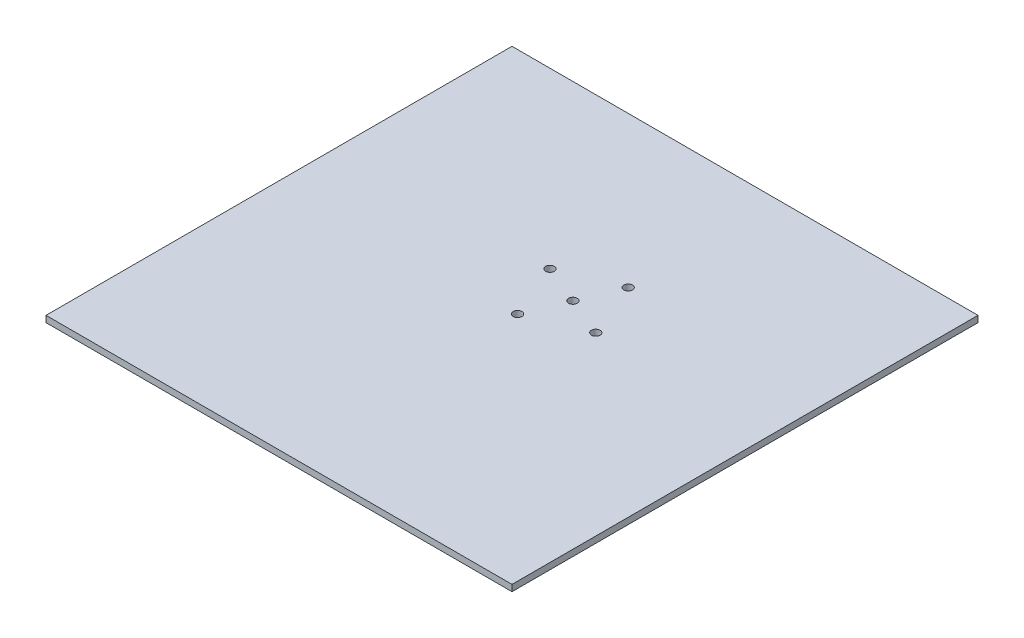
ISO-10303-21;
HEADER;
FILE_DESCRIPTION(('STEP AP214'),'2;1');
FILE_NAME('part.step','',(''),(''),'','','');
FILE_SCHEMA(('AUTOMOTIVE_DESIGN { 1 0 10303 214 1 1 1 1 }'));
ENDSEC;
DATA;
#1=APPLICATION_CONTEXT('core data for automotive mechanical design processes');
#2=APPLICATION_PROTOCOL_DEFINITION('international standard','automotive_design',2000,#1);
#3=PRODUCT_CONTEXT('',#1,'mechanical');
#4=PRODUCT('Part','Part','',(#3));
#5=PRODUCT_RELATED_PRODUCT_CATEGORY('part','',(#4));
#6=PRODUCT_DEFINITION_FORMATION('','',#4);
#7=PRODUCT_DEFINITION_CONTEXT('part definition',#1,'design');
#8=PRODUCT_DEFINITION('design','',#6,#7);
#9=PRODUCT_DEFINITION_SHAPE('','',#8);
#10=(LENGTH_UNIT() NAMED_UNIT(*) SI_UNIT(.MILLI.,.METRE.));
#11=(NAMED_UNIT(*) PLANE_ANGLE_UNIT() SI_UNIT($,.RADIAN.));
#12=(NAMED_UNIT(*) SI_UNIT($,.STERADIAN.) SOLID_ANGLE_UNIT());
#13=UNCERTAINTY_MEASURE_WITH_UNIT(LENGTH_MEASURE(1.E-05),#10,'distance_accuracy_value','');
#14=(GEOMETRIC_REPRESENTATION_CONTEXT(3) GLOBAL_UNCERTAINTY_ASSIGNED_CONTEXT((#13)) GLOBAL_UNIT_ASSIGNED_CONTEXT((#10,
#11,#12)) REPRESENTATION_CONTEXT('',''));
#15=CARTESIAN_POINT('',(0.,0.,0.));
#16=DIRECTION('',(0.,0.,1.));
#17=DIRECTION('',(1.,0.,0.));
#18=AXIS2_PLACEMENT_3D('',#15,#16,#17);
#19=CARTESIAN_POINT('',(110.,3.,-110.));
#20=DIRECTION('',(-1.,0.,0.));
#21=DIRECTION('',(0.,0.,1.));
#22=AXIS2_PLACEMENT_3D('',#19,#20,#21);
#23=PLANE('',#22);
#24=DIRECTION('',(0.,0.,-1.));
#25=VECTOR('',#24,1.);
#26=CARTESIAN_POINT('',(110.,0.,-110.));
#27=LINE('',#26,#25);
#28=CARTESIAN_POINT('',(110.,0.,110.));
#29=VERTEX_POINT('',#28);
#30=CARTESIAN_POINT('',(110.,0.,-110.));
#31=VERTEX_POINT('',#30);
#32=EDGE_CURVE('E105',#29,#31,#27,.T.);
#33=ORIENTED_EDGE('',*,*,#32,.T.);
#34=DIRECTION('',(0.,-1.,0.));
#35=VECTOR('',#34,1.);
#36=CARTESIAN_POINT('',(110.,3.,-110.));
#37=LINE('',#36,#35);
#38=CARTESIAN_POINT('',(110.,3.,-110.));
#39=VERTEX_POINT('',#38);
#40=EDGE_CURVE('E11',#39,#31,#37,.T.);
#41=ORIENTED_EDGE('',*,*,#40,.F.);
#42=DIRECTION('',(0.,0.,-1.));
#43=VECTOR('',#42,1.);
#44=CARTESIAN_POINT('',(110.,3.,-110.));
#45=LINE('',#44,#43);
#46=CARTESIAN_POINT('',(110.,3.,110.));
#47=VERTEX_POINT('',#46);
#48=EDGE_CURVE('E92',#47,#39,#45,.T.);
#49=ORIENTED_EDGE('',*,*,#48,.F.);
#50=DIRECTION('',(0.,-1.,0.));
#51=VECTOR('',#50,1.);
#52=CARTESIAN_POINT('',(110.,3.,110.));
#53=LINE('',#52,#51);
#54=EDGE_CURVE('E101',#47,#29,#53,.T.);
#55=ORIENTED_EDGE('',*,*,#54,.T.);
#56=EDGE_LOOP('',(#33,#41,#49,#55));
#57=FACE_BOUND('',#56,.T.);
#58=ADVANCED_FACE('F39',(#57),#23,.F.);
#59=CARTESIAN_POINT('',(-110.,3.,-110.));
#60=DIRECTION('',(0.,0.,1.));
#61=DIRECTION('',(1.,0.,0.));
#62=AXIS2_PLACEMENT_3D('',#59,#60,#61);
#63=PLANE('',#62);
#64=DIRECTION('',(-1.,0.,0.));
#65=VECTOR('',#64,1.);
#66=CARTESIAN_POINT('',(-110.,0.,-110.));
#67=LINE('',#66,#65);
#68=CARTESIAN_POINT('',(-110.,0.,-110.));
#69=VERTEX_POINT('',#68);
#70=EDGE_CURVE('E96',#31,#69,#67,.T.);
#71=ORIENTED_EDGE('',*,*,#70,.T.);
#72=DIRECTION('',(0.,-1.,0.));
#73=VECTOR('',#72,1.);
#74=CARTESIAN_POINT('',(-110.,3.,-110.));
#75=LINE('',#74,#73);
#76=CARTESIAN_POINT('',(-110.,3.,-110.));
#77=VERTEX_POINT('',#76);
#78=EDGE_CURVE('E48',#77,#69,#75,.T.);
#79=ORIENTED_EDGE('',*,*,#78,.F.);
#80=DIRECTION('',(-1.,0.,0.));
#81=VECTOR('',#80,1.);
#82=CARTESIAN_POINT('',(-110.,3.,-110.));
#83=LINE('',#82,#81);
#84=EDGE_CURVE('E87',#39,#77,#83,.T.);
#85=ORIENTED_EDGE('',*,*,#84,.F.);
#86=ORIENTED_EDGE('',*,*,#40,.T.);
#87=EDGE_LOOP('',(#71,#79,#85,#86));
#88=FACE_BOUND('',#87,.T.);
#89=ADVANCED_FACE('F95',(#88),#63,.F.);
#90=CARTESIAN_POINT('',(-110.,3.,-110.));
#91=DIRECTION('',(1.,0.,0.));
#92=DIRECTION('',(0.,0.,-1.));
#93=AXIS2_PLACEMENT_3D('',#90,#91,#92);
#94=PLANE('',#93);
#95=DIRECTION('',(0.,0.,1.));
#96=VECTOR('',#95,1.);
#97=CARTESIAN_POINT('',(-110.,0.,-110.));
#98=LINE('',#97,#96);
#99=CARTESIAN_POINT('',(-110.,0.,110.));
#100=VERTEX_POINT('',#99);
#101=EDGE_CURVE('E74',#69,#100,#98,.T.);
#102=ORIENTED_EDGE('',*,*,#101,.T.);
#103=DIRECTION('',(0.,-1.,0.));
#104=VECTOR('',#103,1.);
#105=CARTESIAN_POINT('',(-110.,3.,110.));
#106=LINE('',#105,#104);
#107=CARTESIAN_POINT('',(-110.,3.,110.));
#108=VERTEX_POINT('',#107);
#109=EDGE_CURVE('E97',#108,#100,#106,.T.);
#110=ORIENTED_EDGE('',*,*,#109,.F.);
#111=DIRECTION('',(0.,0.,1.));
#112=VECTOR('',#111,1.);
#113=CARTESIAN_POINT('',(-110.,3.,-110.));
#114=LINE('',#113,#112);
#115=EDGE_CURVE('E90',#77,#108,#114,.T.);
#116=ORIENTED_EDGE('',*,*,#115,.F.);
#117=ORIENTED_EDGE('',*,*,#78,.T.);
#118=EDGE_LOOP('',(#102,#110,#116,#117));
#119=FACE_BOUND('',#118,.T.);
#120=ADVANCED_FACE('F99',(#119),#94,.F.);
#121=CARTESIAN_POINT('',(-110.,3.,110.));
#122=DIRECTION('',(0.,0.,-1.));
#123=DIRECTION('',(-1.,0.,0.));
#124=AXIS2_PLACEMENT_3D('',#121,#122,#123);
#125=PLANE('',#124);
#126=DIRECTION('',(1.,0.,0.));
#127=VECTOR('',#126,1.);
#128=CARTESIAN_POINT('',(-110.,0.,110.));
#129=LINE('',#128,#127);
#130=EDGE_CURVE('E80',#100,#29,#129,.T.);
#131=ORIENTED_EDGE('',*,*,#130,.T.);
#132=ORIENTED_EDGE('',*,*,#54,.F.);
#133=DIRECTION('',(1.,0.,0.));
#134=VECTOR('',#133,1.);
#135=CARTESIAN_POINT('',(-110.,3.,110.));
#136=LINE('',#135,#134);
#137=EDGE_CURVE('E57',#108,#47,#136,.T.);
#138=ORIENTED_EDGE('',*,*,#137,.F.);
#139=ORIENTED_EDGE('',*,*,#109,.T.);
#140=EDGE_LOOP('',(#131,#132,#138,#139));
#141=FACE_BOUND('',#140,.T.);
#142=ADVANCED_FACE('F161',(#141),#125,.F.);
#143=CARTESIAN_POINT('',(0.,3.,0.));
#144=DIRECTION('',(0.,1.,0.));
#145=DIRECTION('',(0.,0.,1.));
#146=AXIS2_PLACEMENT_3D('',#143,#144,#145);
#147=PLANE('',#146);
#148=CARTESIAN_POINT('',(16.0549965244678,3.,-38.8102703752413));
#149=DIRECTION('',(0.,-1.,0.));
#150=DIRECTION('',(0.,0.,-1.));
#151=AXIS2_PLACEMENT_3D('',#148,#149,#150);
#152=CIRCLE('',#151,2.05);
#153=CARTESIAN_POINT('',(16.0549965244678,3.,-40.8602703752413));
#154=VERTEX_POINT('',#153);
#155=EDGE_CURVE('E117',#154,#154,#152,.T.);
#156=ORIENTED_EDGE('',*,*,#155,.T.);
#157=EDGE_LOOP('',(#156));
#158=FACE_BOUND('',#157,.T.);
#159=CARTESIAN_POINT('',(8.40976008424499,3.,-20.3291892441741));
#160=DIRECTION('',(0.,-1.,0.));
#161=DIRECTION('',(0.,0.,-1.));
#162=AXIS2_PLACEMENT_3D('',#159,#160,#161);
#163=CIRCLE('',#162,2.05);
#164=CARTESIAN_POINT('',(8.40976008424499,3.,-22.3791892441741));
#165=VERTEX_POINT('',#164);
#166=EDGE_CURVE('E234',#165,#165,#163,.T.);
#167=ORIENTED_EDGE('',*,*,#166,.T.);
#168=EDGE_LOOP('',(#167));
#169=FACE_BOUND('',#168,.T.);
#170=CARTESIAN_POINT('',(26.8908412153122,3.,-12.6839528039512));
#171=DIRECTION('',(0.,-1.,0.));
#172=DIRECTION('',(0.,0.,-1.));
#173=AXIS2_PLACEMENT_3D('',#170,#171,#172);
#174=CIRCLE('',#173,2.04999999999999);
#175=CARTESIAN_POINT('',(26.8908412153122,3.,-14.7339528039512));
#176=VERTEX_POINT('',#175);
#177=EDGE_CURVE('E224',#176,#176,#174,.T.);
#178=ORIENTED_EDGE('',*,*,#177,.T.);
#179=EDGE_LOOP('',(#178));
#180=FACE_BOUND('',#179,.T.);
#181=CARTESIAN_POINT('',(0.764523644022143,3.,-1.84810811310683));
#182=DIRECTION('',(0.,-1.,0.));
#183=DIRECTION('',(0.,0.,-1.));
#184=AXIS2_PLACEMENT_3D('',#181,#182,#183);
#185=CIRCLE('',#184,2.05);
#186=CARTESIAN_POINT('',(0.764523644022143,3.,-3.89810811310683));
#187=VERTEX_POINT('',#186);
#188=EDGE_CURVE('E235',#187,#187,#185,.T.);
#189=ORIENTED_EDGE('',*,*,#188,.T.);
#190=EDGE_LOOP('',(#189));
#191=FACE_BOUND('',#190,.T.);
#192=CARTESIAN_POINT('',(-10.0713210468222,3.,-27.9744256843969));
#193=DIRECTION('',(0.,-1.,0.));
#194=DIRECTION('',(0.,0.,-1.));
#195=AXIS2_PLACEMENT_3D('',#192,#193,#194);
#196=CIRCLE('',#195,2.05);
#197=CARTESIAN_POINT('',(-10.0713210468222,3.,-30.0244256843969));
#198=VERTEX_POINT('',#197);
#199=EDGE_CURVE('E240',#198,#198,#196,.T.);
#200=ORIENTED_EDGE('',*,*,#199,.T.);
#201=EDGE_LOOP('',(#200));
#202=FACE_BOUND('',#201,.T.);
#203=ORIENTED_EDGE('',*,*,#48,.T.);
#204=ORIENTED_EDGE('',*,*,#84,.T.);
#205=ORIENTED_EDGE('',*,*,#115,.T.);
#206=ORIENTED_EDGE('',*,*,#137,.T.);
#207=EDGE_LOOP('',(#203,#204,#205,#206));
#208=FACE_BOUND('',#207,.T.);
#209=ADVANCED_FACE('F88',(#158,#169,#180,#191,#202,#208),#147,.T.);
#210=CARTESIAN_POINT('',(0.,0.,0.));
#211=DIRECTION('',(0.,1.,0.));
#212=DIRECTION('',(0.,0.,1.));
#213=AXIS2_PLACEMENT_3D('',#210,#211,#212);
#214=PLANE('',#213);
#215=CARTESIAN_POINT('',(16.0549965244678,0.,-38.8102703752413));
#216=DIRECTION('',(0.,1.,0.));
#217=DIRECTION('',(0.,0.,1.));
#218=AXIS2_PLACEMENT_3D('',#215,#216,#217);
#219=CIRCLE('',#218,2.05);
#220=CARTESIAN_POINT('',(16.0549965244678,0.,-36.7602703752413));
#221=VERTEX_POINT('',#220);
#222=EDGE_CURVE('E42',#221,#221,#219,.T.);
#223=ORIENTED_EDGE('',*,*,#222,.T.);
#224=EDGE_LOOP('',(#223));
#225=FACE_BOUND('',#224,.T.);
#226=CARTESIAN_POINT('',(8.40976008424499,0.,-20.3291892441741));
#227=DIRECTION('',(0.,1.,0.));
#228=DIRECTION('',(0.,0.,1.));
#229=AXIS2_PLACEMENT_3D('',#226,#227,#228);
#230=CIRCLE('',#229,2.05);
#231=CARTESIAN_POINT('',(8.40976008424499,0.,-18.279189244174));
#232=VERTEX_POINT('',#231);
#233=EDGE_CURVE('E122',#232,#232,#230,.T.);
#234=ORIENTED_EDGE('',*,*,#233,.T.);
#235=EDGE_LOOP('',(#234));
#236=FACE_BOUND('',#235,.T.);
#237=CARTESIAN_POINT('',(26.8908412153122,0.,-12.6839528039512));
#238=DIRECTION('',(0.,1.,0.));
#239=DIRECTION('',(0.,0.,1.));
#240=AXIS2_PLACEMENT_3D('',#237,#238,#239);
#241=CIRCLE('',#240,2.04999999999999);
#242=CARTESIAN_POINT('',(26.8908412153122,0.,-10.6339528039512));
#243=VERTEX_POINT('',#242);
#244=EDGE_CURVE('E120',#243,#243,#241,.T.);
#245=ORIENTED_EDGE('',*,*,#244,.T.);
#246=EDGE_LOOP('',(#245));
#247=FACE_BOUND('',#246,.T.);
#248=CARTESIAN_POINT('',(0.764523644022143,0.,-1.84810811310683));
#249=DIRECTION('',(0.,1.,0.));
#250=DIRECTION('',(0.,0.,1.));
#251=AXIS2_PLACEMENT_3D('',#248,#249,#250);
#252=CIRCLE('',#251,2.05);
#253=CARTESIAN_POINT('',(0.764523644022143,0.,0.201891886893164));
#254=VERTEX_POINT('',#253);
#255=EDGE_CURVE('E116',#254,#254,#252,.T.);
#256=ORIENTED_EDGE('',*,*,#255,.T.);
#257=EDGE_LOOP('',(#256));
#258=FACE_BOUND('',#257,.T.);
#259=CARTESIAN_POINT('',(-10.0713210468222,0.,-27.9744256843969));
#260=DIRECTION('',(0.,1.,0.));
#261=DIRECTION('',(0.,0.,1.));
#262=AXIS2_PLACEMENT_3D('',#259,#260,#261);
#263=CIRCLE('',#262,2.05);
#264=CARTESIAN_POINT('',(-10.0713210468222,0.,-25.9244256843969));
#265=VERTEX_POINT('',#264);
#266=EDGE_CURVE('E113',#265,#265,#263,.T.);
#267=ORIENTED_EDGE('',*,*,#266,.T.);
#268=EDGE_LOOP('',(#267));
#269=FACE_BOUND('',#268,.T.);
#270=ORIENTED_EDGE('',*,*,#32,.F.);
#271=ORIENTED_EDGE('',*,*,#130,.F.);
#272=ORIENTED_EDGE('',*,*,#101,.F.);
#273=ORIENTED_EDGE('',*,*,#70,.F.);
#274=EDGE_LOOP('',(#270,#271,#272,#273));
#275=FACE_BOUND('',#274,.T.);
#276=ADVANCED_FACE('F129',(#225,#236,#247,#258,#269,#275),#214,.F.);
#277=CARTESIAN_POINT('',(-10.0713210468222,3.,-27.9744256843969));
#278=DIRECTION('',(0.,-1.,0.));
#279=DIRECTION('',(0.,0.,-1.));
#280=AXIS2_PLACEMENT_3D('',#277,#278,#279);
#281=CYLINDRICAL_SURFACE('',#280,2.05);
#282=ORIENTED_EDGE('',*,*,#199,.F.);
#283=EDGE_LOOP('',(#282));
#284=FACE_BOUND('',#283,.T.);
#285=ORIENTED_EDGE('',*,*,#266,.F.);
#286=EDGE_LOOP('',(#285));
#287=FACE_BOUND('',#286,.T.);
#288=ADVANCED_FACE('F151',(#284,#287),#281,.F.);
#289=CARTESIAN_POINT('',(0.764523644022143,3.,-1.84810811310683));
#290=DIRECTION('',(0.,-1.,0.));
#291=DIRECTION('',(0.,0.,-1.));
#292=AXIS2_PLACEMENT_3D('',#289,#290,#291);
#293=CYLINDRICAL_SURFACE('',#292,2.05);
#294=ORIENTED_EDGE('',*,*,#188,.F.);
#295=EDGE_LOOP('',(#294));
#296=FACE_BOUND('',#295,.T.);
#297=ORIENTED_EDGE('',*,*,#255,.F.);
#298=EDGE_LOOP('',(#297));
#299=FACE_BOUND('',#298,.T.);
#300=ADVANCED_FACE('F158',(#296,#299),#293,.F.);
#301=CARTESIAN_POINT('',(26.8908412153122,3.,-12.6839528039512));
#302=DIRECTION('',(0.,-1.,0.));
#303=DIRECTION('',(0.,0.,-1.));
#304=AXIS2_PLACEMENT_3D('',#301,#302,#303);
#305=CYLINDRICAL_SURFACE('',#304,2.04999999999999);
#306=ORIENTED_EDGE('',*,*,#177,.F.);
#307=EDGE_LOOP('',(#306));
#308=FACE_BOUND('',#307,.T.);
#309=ORIENTED_EDGE('',*,*,#244,.F.);
#310=EDGE_LOOP('',(#309));
#311=FACE_BOUND('',#310,.T.);
#312=ADVANCED_FACE('F139',(#308,#311),#305,.F.);
#313=CARTESIAN_POINT('',(8.40976008424499,3.,-20.3291892441741));
#314=DIRECTION('',(0.,-1.,0.));
#315=DIRECTION('',(0.,0.,-1.));
#316=AXIS2_PLACEMENT_3D('',#313,#314,#315);
#317=CYLINDRICAL_SURFACE('',#316,2.05);
#318=ORIENTED_EDGE('',*,*,#166,.F.);
#319=EDGE_LOOP('',(#318));
#320=FACE_BOUND('',#319,.T.);
#321=ORIENTED_EDGE('',*,*,#233,.F.);
#322=EDGE_LOOP('',(#321));
#323=FACE_BOUND('',#322,.T.);
#324=ADVANCED_FACE('F133',(#320,#323),#317,.F.);
#325=CARTESIAN_POINT('',(16.0549965244678,3.,-38.8102703752413));
#326=DIRECTION('',(0.,-1.,0.));
#327=DIRECTION('',(0.,0.,-1.));
#328=AXIS2_PLACEMENT_3D('',#325,#326,#327);
#329=CYLINDRICAL_SURFACE('',#328,2.05);
#330=ORIENTED_EDGE('',*,*,#155,.F.);
#331=EDGE_LOOP('',(#330));
#332=FACE_BOUND('',#331,.T.);
#333=ORIENTED_EDGE('',*,*,#222,.F.);
#334=EDGE_LOOP('',(#333));
#335=FACE_BOUND('',#334,.T.);
#336=ADVANCED_FACE('F131',(#332,#335),#329,.F.);
#337=CLOSED_SHELL('',(#58,#89,#120,#142,#209,#276,#288,#300,#312,#324,#336));
#338=MANIFOLD_SOLID_BREP('B2',#337);
#339=ADVANCED_BREP_SHAPE_REPRESENTATION('',(#18,#338),#14);
#340=SHAPE_DEFINITION_REPRESENTATION(#9,#339);
ENDSEC;
END-ISO-10303-21;
